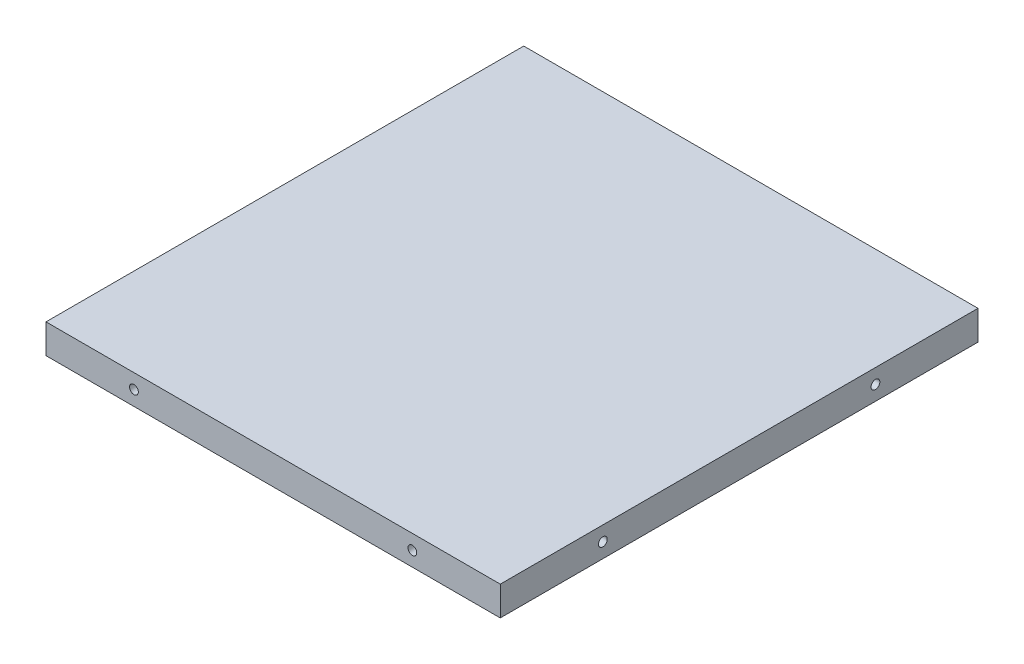
ISO-10303-21;
HEADER;
FILE_DESCRIPTION(('STEP AP214'),'2;1');
FILE_NAME('part.step','',(''),(''),'','','');
FILE_SCHEMA(('AUTOMOTIVE_DESIGN { 1 0 10303 214 1 1 1 1 }'));
ENDSEC;
DATA;
#1=APPLICATION_CONTEXT('core data for automotive mechanical design processes');
#2=APPLICATION_PROTOCOL_DEFINITION('international standard','automotive_design',2000,#1);
#3=PRODUCT_CONTEXT('',#1,'mechanical');
#4=PRODUCT('Part','Part','',(#3));
#5=PRODUCT_RELATED_PRODUCT_CATEGORY('part','',(#4));
#6=PRODUCT_DEFINITION_FORMATION('','',#4);
#7=PRODUCT_DEFINITION_CONTEXT('part definition',#1,'design');
#8=PRODUCT_DEFINITION('design','',#6,#7);
#9=PRODUCT_DEFINITION_SHAPE('','',#8);
#10=(LENGTH_UNIT() NAMED_UNIT(*) SI_UNIT(.MILLI.,.METRE.));
#11=(NAMED_UNIT(*) PLANE_ANGLE_UNIT() SI_UNIT($,.RADIAN.));
#12=(NAMED_UNIT(*) SI_UNIT($,.STERADIAN.) SOLID_ANGLE_UNIT());
#13=UNCERTAINTY_MEASURE_WITH_UNIT(LENGTH_MEASURE(1.E-05),#10,'distance_accuracy_value','');
#14=(GEOMETRIC_REPRESENTATION_CONTEXT(3) GLOBAL_UNCERTAINTY_ASSIGNED_CONTEXT((#13)) GLOBAL_UNIT_ASSIGNED_CONTEXT((#10,
#11,#12)) REPRESENTATION_CONTEXT('',''));
#15=CARTESIAN_POINT('',(0.,0.,0.));
#16=DIRECTION('',(0.,0.,1.));
#17=DIRECTION('',(1.,0.,0.));
#18=AXIS2_PLACEMENT_3D('',#15,#16,#17);
#19=CARTESIAN_POINT('',(0.,10.,0.));
#20=DIRECTION('',(-1.,0.,0.));
#21=DIRECTION('',(0.,0.,1.));
#22=AXIS2_PLACEMENT_3D('',#19,#20,#21);
#23=PLANE('',#22);
#24=CARTESIAN_POINT('',(0.,4.99999999999996,-35.));
#25=DIRECTION('',(1.,0.,0.));
#26=DIRECTION('',(0.,0.,-1.));
#27=AXIS2_PLACEMENT_3D('',#24,#25,#26);
#28=CIRCLE('',#27,1.5);
#29=CARTESIAN_POINT('',(0.,4.99999999999996,-36.5));
#30=VERTEX_POINT('',#29);
#31=EDGE_CURVE('E136',#30,#30,#28,.T.);
#32=ORIENTED_EDGE('',*,*,#31,.T.);
#33=EDGE_LOOP('',(#32));
#34=FACE_BOUND('',#33,.T.);
#35=CARTESIAN_POINT('',(0.,4.99999999999996,-128.));
#36=DIRECTION('',(1.,0.,0.));
#37=DIRECTION('',(0.,0.,1.));
#38=AXIS2_PLACEMENT_3D('',#35,#36,#37);
#39=CIRCLE('',#38,1.5);
#40=CARTESIAN_POINT('',(0.,4.99999999999996,-126.5));
#41=VERTEX_POINT('',#40);
#42=EDGE_CURVE('E144',#41,#41,#39,.T.);
#43=ORIENTED_EDGE('',*,*,#42,.T.);
#44=EDGE_LOOP('',(#43));
#45=FACE_BOUND('',#44,.T.);
#46=DIRECTION('',(0.,0.,-1.));
#47=VECTOR('',#46,1.);
#48=CARTESIAN_POINT('',(0.,0.,0.));
#49=LINE('',#48,#47);
#50=CARTESIAN_POINT('',(0.,0.,0.));
#51=VERTEX_POINT('',#50);
#52=CARTESIAN_POINT('',(0.,0.,-163.));
#53=VERTEX_POINT('',#52);
#54=EDGE_CURVE('E118',#51,#53,#49,.T.);
#55=ORIENTED_EDGE('',*,*,#54,.F.);
#56=DIRECTION('',(0.,-1.,0.));
#57=VECTOR('',#56,1.);
#58=CARTESIAN_POINT('',(0.,10.,0.));
#59=LINE('',#58,#57);
#60=CARTESIAN_POINT('',(0.,10.,0.));
#61=VERTEX_POINT('',#60);
#62=EDGE_CURVE('E11',#61,#51,#59,.T.);
#63=ORIENTED_EDGE('',*,*,#62,.F.);
#64=DIRECTION('',(0.,0.,-1.));
#65=VECTOR('',#64,1.);
#66=CARTESIAN_POINT('',(0.,10.,0.));
#67=LINE('',#66,#65);
#68=CARTESIAN_POINT('',(0.,10.,-163.));
#69=VERTEX_POINT('',#68);
#70=EDGE_CURVE('E110',#61,#69,#67,.T.);
#71=ORIENTED_EDGE('',*,*,#70,.T.);
#72=DIRECTION('',(0.,-1.,0.));
#73=VECTOR('',#72,1.);
#74=CARTESIAN_POINT('',(0.,10.,-163.));
#75=LINE('',#74,#73);
#76=EDGE_CURVE('E86',#69,#53,#75,.T.);
#77=ORIENTED_EDGE('',*,*,#76,.T.);
#78=EDGE_LOOP('',(#55,#63,#71,#77));
#79=FACE_BOUND('',#78,.T.);
#80=ADVANCED_FACE('F44',(#34,#45,#79),#23,.T.);
#81=CARTESIAN_POINT('',(0.,10.,0.));
#82=DIRECTION('',(0.,0.,-1.));
#83=DIRECTION('',(-1.,0.,0.));
#84=AXIS2_PLACEMENT_3D('',#81,#82,#83);
#85=PLANE('',#84);
#86=CARTESIAN_POINT('',(125.,5.,0.));
#87=DIRECTION('',(0.,0.,-1.));
#88=DIRECTION('',(-1.,0.,0.));
#89=AXIS2_PLACEMENT_3D('',#86,#87,#88);
#90=CIRCLE('',#89,1.5);
#91=CARTESIAN_POINT('',(123.5,5.,0.));
#92=VERTEX_POINT('',#91);
#93=EDGE_CURVE('E157',#92,#92,#90,.T.);
#94=ORIENTED_EDGE('',*,*,#93,.T.);
#95=EDGE_LOOP('',(#94));
#96=FACE_BOUND('',#95,.T.);
#97=CARTESIAN_POINT('',(30.,5.00000000000001,0.));
#98=DIRECTION('',(0.,0.,-1.));
#99=DIRECTION('',(1.,0.,0.));
#100=AXIS2_PLACEMENT_3D('',#97,#98,#99);
#101=CIRCLE('',#100,1.5);
#102=CARTESIAN_POINT('',(31.5,5.00000000000001,0.));
#103=VERTEX_POINT('',#102);
#104=EDGE_CURVE('E142',#103,#103,#101,.T.);
#105=ORIENTED_EDGE('',*,*,#104,.T.);
#106=EDGE_LOOP('',(#105));
#107=FACE_BOUND('',#106,.T.);
#108=DIRECTION('',(1.,0.,0.));
#109=VECTOR('',#108,1.);
#110=CARTESIAN_POINT('',(0.,0.,0.));
#111=LINE('',#110,#109);
#112=CARTESIAN_POINT('',(155.,0.,0.));
#113=VERTEX_POINT('',#112);
#114=EDGE_CURVE('E78',#51,#113,#111,.T.);
#115=ORIENTED_EDGE('',*,*,#114,.T.);
#116=DIRECTION('',(0.,-1.,0.));
#117=VECTOR('',#116,1.);
#118=CARTESIAN_POINT('',(155.,10.,0.));
#119=LINE('',#118,#117);
#120=CARTESIAN_POINT('',(155.,10.,0.));
#121=VERTEX_POINT('',#120);
#122=EDGE_CURVE('E54',#121,#113,#119,.T.);
#123=ORIENTED_EDGE('',*,*,#122,.F.);
#124=DIRECTION('',(1.,0.,0.));
#125=VECTOR('',#124,1.);
#126=CARTESIAN_POINT('',(0.,10.,0.));
#127=LINE('',#126,#125);
#128=EDGE_CURVE('E96',#61,#121,#127,.T.);
#129=ORIENTED_EDGE('',*,*,#128,.F.);
#130=ORIENTED_EDGE('',*,*,#62,.T.);
#131=EDGE_LOOP('',(#115,#123,#129,#130));
#132=FACE_BOUND('',#131,.T.);
#133=ADVANCED_FACE('F198',(#96,#107,#132),#85,.F.);
#134=CARTESIAN_POINT('',(155.,10.,0.));
#135=DIRECTION('',(-1.,0.,0.));
#136=DIRECTION('',(0.,0.,1.));
#137=AXIS2_PLACEMENT_3D('',#134,#135,#136);
#138=PLANE('',#137);
#139=CARTESIAN_POINT('',(155.,4.99999999999996,-35.));
#140=DIRECTION('',(-1.,0.,0.));
#141=DIRECTION('',(0.,0.,1.));
#142=AXIS2_PLACEMENT_3D('',#139,#140,#141);
#143=CIRCLE('',#142,1.5);
#144=CARTESIAN_POINT('',(155.,4.99999999999996,-33.5));
#145=VERTEX_POINT('',#144);
#146=EDGE_CURVE('E47',#145,#145,#143,.T.);
#147=ORIENTED_EDGE('',*,*,#146,.T.);
#148=EDGE_LOOP('',(#147));
#149=FACE_BOUND('',#148,.T.);
#150=CARTESIAN_POINT('',(155.,4.99999999999996,-128.));
#151=DIRECTION('',(-1.,0.,0.));
#152=DIRECTION('',(0.,0.,1.));
#153=AXIS2_PLACEMENT_3D('',#150,#151,#152);
#154=CIRCLE('',#153,1.5);
#155=CARTESIAN_POINT('',(155.,4.99999999999996,-126.5));
#156=VERTEX_POINT('',#155);
#157=EDGE_CURVE('E133',#156,#156,#154,.T.);
#158=ORIENTED_EDGE('',*,*,#157,.T.);
#159=EDGE_LOOP('',(#158));
#160=FACE_BOUND('',#159,.T.);
#161=DIRECTION('',(0.,0.,-1.));
#162=VECTOR('',#161,1.);
#163=CARTESIAN_POINT('',(155.,0.,0.));
#164=LINE('',#163,#162);
#165=CARTESIAN_POINT('',(155.,0.,-163.));
#166=VERTEX_POINT('',#165);
#167=EDGE_CURVE('E104',#113,#166,#164,.T.);
#168=ORIENTED_EDGE('',*,*,#167,.T.);
#169=DIRECTION('',(0.,-1.,0.));
#170=VECTOR('',#169,1.);
#171=CARTESIAN_POINT('',(155.,10.,-163.));
#172=LINE('',#171,#170);
#173=CARTESIAN_POINT('',(155.,10.,-163.));
#174=VERTEX_POINT('',#173);
#175=EDGE_CURVE('E101',#174,#166,#172,.T.);
#176=ORIENTED_EDGE('',*,*,#175,.F.);
#177=DIRECTION('',(0.,0.,-1.));
#178=VECTOR('',#177,1.);
#179=CARTESIAN_POINT('',(155.,10.,0.));
#180=LINE('',#179,#178);
#181=EDGE_CURVE('E91',#121,#174,#180,.T.);
#182=ORIENTED_EDGE('',*,*,#181,.F.);
#183=ORIENTED_EDGE('',*,*,#122,.T.);
#184=EDGE_LOOP('',(#168,#176,#182,#183));
#185=FACE_BOUND('',#184,.T.);
#186=ADVANCED_FACE('F102',(#149,#160,#185),#138,.F.);
#187=CARTESIAN_POINT('',(0.,10.,-163.));
#188=DIRECTION('',(0.,0.,-1.));
#189=DIRECTION('',(-1.,0.,0.));
#190=AXIS2_PLACEMENT_3D('',#187,#188,#189);
#191=PLANE('',#190);
#192=CARTESIAN_POINT('',(125.,5.,-163.));
#193=DIRECTION('',(0.,0.,-1.));
#194=DIRECTION('',(-1.,0.,0.));
#195=AXIS2_PLACEMENT_3D('',#192,#193,#194);
#196=CIRCLE('',#195,1.5);
#197=CARTESIAN_POINT('',(123.5,5.,-163.));
#198=VERTEX_POINT('',#197);
#199=EDGE_CURVE('E171',#198,#198,#196,.T.);
#200=ORIENTED_EDGE('',*,*,#199,.F.);
#201=EDGE_LOOP('',(#200));
#202=FACE_BOUND('',#201,.T.);
#203=CARTESIAN_POINT('',(30.,5.00000000000001,-163.));
#204=DIRECTION('',(0.,0.,-1.));
#205=DIRECTION('',(1.,0.,0.));
#206=AXIS2_PLACEMENT_3D('',#203,#204,#205);
#207=CIRCLE('',#206,1.5);
#208=CARTESIAN_POINT('',(31.5,5.00000000000001,-163.));
#209=VERTEX_POINT('',#208);
#210=EDGE_CURVE('E175',#209,#209,#207,.T.);
#211=ORIENTED_EDGE('',*,*,#210,.F.);
#212=EDGE_LOOP('',(#211));
#213=FACE_BOUND('',#212,.T.);
#214=DIRECTION('',(1.,0.,0.));
#215=VECTOR('',#214,1.);
#216=CARTESIAN_POINT('',(0.,0.,-163.));
#217=LINE('',#216,#215);
#218=EDGE_CURVE('E122',#53,#166,#217,.T.);
#219=ORIENTED_EDGE('',*,*,#218,.F.);
#220=ORIENTED_EDGE('',*,*,#76,.F.);
#221=DIRECTION('',(1.,0.,0.));
#222=VECTOR('',#221,1.);
#223=CARTESIAN_POINT('',(0.,10.,-163.));
#224=LINE('',#223,#222);
#225=EDGE_CURVE('E95',#69,#174,#224,.T.);
#226=ORIENTED_EDGE('',*,*,#225,.T.);
#227=ORIENTED_EDGE('',*,*,#175,.T.);
#228=EDGE_LOOP('',(#219,#220,#226,#227));
#229=FACE_BOUND('',#228,.T.);
#230=ADVANCED_FACE('F108',(#202,#213,#229),#191,.T.);
#231=CARTESIAN_POINT('',(0.,10.,0.));
#232=DIRECTION('',(0.,-1.,0.));
#233=DIRECTION('',(0.,0.,-1.));
#234=AXIS2_PLACEMENT_3D('',#231,#232,#233);
#235=PLANE('',#234);
#236=ORIENTED_EDGE('',*,*,#70,.F.);
#237=ORIENTED_EDGE('',*,*,#128,.T.);
#238=ORIENTED_EDGE('',*,*,#181,.T.);
#239=ORIENTED_EDGE('',*,*,#225,.F.);
#240=EDGE_LOOP('',(#236,#237,#238,#239));
#241=FACE_BOUND('',#240,.T.);
#242=ADVANCED_FACE('F94',(#241),#235,.F.);
#243=CARTESIAN_POINT('',(0.,0.,0.));
#244=DIRECTION('',(0.,-1.,0.));
#245=DIRECTION('',(0.,0.,-1.));
#246=AXIS2_PLACEMENT_3D('',#243,#244,#245);
#247=PLANE('',#246);
#248=ORIENTED_EDGE('',*,*,#54,.T.);
#249=ORIENTED_EDGE('',*,*,#218,.T.);
#250=ORIENTED_EDGE('',*,*,#167,.F.);
#251=ORIENTED_EDGE('',*,*,#114,.F.);
#252=EDGE_LOOP('',(#248,#249,#250,#251));
#253=FACE_BOUND('',#252,.T.);
#254=ADVANCED_FACE('F187',(#253),#247,.T.);
#255=CARTESIAN_POINT('',(30.,5.00000000000001,-143.));
#256=DIRECTION('',(0.,0.,-1.));
#257=DIRECTION('',(-1.,0.,0.));
#258=AXIS2_PLACEMENT_3D('',#255,#256,#257);
#259=CYLINDRICAL_SURFACE('',#258,1.5);
#260=CARTESIAN_POINT('',(30.,5.00000000000001,-143.));
#261=DIRECTION('',(0.,0.,-1.));
#262=DIRECTION('',(1.,0.,0.));
#263=AXIS2_PLACEMENT_3D('',#260,#261,#262);
#264=CIRCLE('',#263,1.5);
#265=CARTESIAN_POINT('',(31.5,5.00000000000001,-143.));
#266=VERTEX_POINT('',#265);
#267=EDGE_CURVE('E156',#266,#266,#264,.T.);
#268=ORIENTED_EDGE('',*,*,#267,.F.);
#269=EDGE_LOOP('',(#268));
#270=FACE_BOUND('',#269,.T.);
#271=ORIENTED_EDGE('',*,*,#210,.T.);
#272=EDGE_LOOP('',(#271));
#273=FACE_BOUND('',#272,.T.);
#274=ADVANCED_FACE('F184',(#270,#273),#259,.F.);
#275=CARTESIAN_POINT('',(30.,5.00000000000001,-143.));
#276=DIRECTION('',(0.,0.,1.));
#277=DIRECTION('',(1.,0.,0.));
#278=AXIS2_PLACEMENT_3D('',#275,#276,#277);
#279=PLANE('',#278);
#280=ORIENTED_EDGE('',*,*,#267,.T.);
#281=EDGE_LOOP('',(#280));
#282=FACE_BOUND('',#281,.T.);
#283=ADVANCED_FACE('F182',(#282),#279,.F.);
#284=CARTESIAN_POINT('',(125.,5.,-143.));
#285=DIRECTION('',(0.,0.,-1.));
#286=DIRECTION('',(-1.,0.,0.));
#287=AXIS2_PLACEMENT_3D('',#284,#285,#286);
#288=CYLINDRICAL_SURFACE('',#287,1.5);
#289=CARTESIAN_POINT('',(125.,5.,-143.));
#290=DIRECTION('',(0.,0.,-1.));
#291=DIRECTION('',(-1.,0.,0.));
#292=AXIS2_PLACEMENT_3D('',#289,#290,#291);
#293=CIRCLE('',#292,1.5);
#294=CARTESIAN_POINT('',(123.5,5.,-143.));
#295=VERTEX_POINT('',#294);
#296=EDGE_CURVE('E123',#295,#295,#293,.T.);
#297=ORIENTED_EDGE('',*,*,#296,.F.);
#298=EDGE_LOOP('',(#297));
#299=FACE_BOUND('',#298,.T.);
#300=ORIENTED_EDGE('',*,*,#199,.T.);
#301=EDGE_LOOP('',(#300));
#302=FACE_BOUND('',#301,.T.);
#303=ADVANCED_FACE('F217',(#299,#302),#288,.F.);
#304=CARTESIAN_POINT('',(125.,5.,-143.));
#305=DIRECTION('',(0.,0.,-1.));
#306=DIRECTION('',(-1.,0.,0.));
#307=AXIS2_PLACEMENT_3D('',#304,#305,#306);
#308=PLANE('',#307);
#309=ORIENTED_EDGE('',*,*,#296,.T.);
#310=EDGE_LOOP('',(#309));
#311=FACE_BOUND('',#310,.T.);
#312=ADVANCED_FACE('F221',(#311),#308,.T.);
#313=CARTESIAN_POINT('',(30.,5.00000000000001,-20.));
#314=DIRECTION('',(0.,0.,1.));
#315=DIRECTION('',(1.,0.,0.));
#316=AXIS2_PLACEMENT_3D('',#313,#314,#315);
#317=CYLINDRICAL_SURFACE('',#316,1.5);
#318=CARTESIAN_POINT('',(30.,5.00000000000001,-20.));
#319=DIRECTION('',(0.,0.,-1.));
#320=DIRECTION('',(1.,0.,0.));
#321=AXIS2_PLACEMENT_3D('',#318,#319,#320);
#322=CIRCLE('',#321,1.5);
#323=CARTESIAN_POINT('',(31.5,5.00000000000001,-20.));
#324=VERTEX_POINT('',#323);
#325=EDGE_CURVE('E161',#324,#324,#322,.T.);
#326=ORIENTED_EDGE('',*,*,#325,.T.);
#327=EDGE_LOOP('',(#326));
#328=FACE_BOUND('',#327,.T.);
#329=ORIENTED_EDGE('',*,*,#104,.F.);
#330=EDGE_LOOP('',(#329));
#331=FACE_BOUND('',#330,.T.);
#332=ADVANCED_FACE('F225',(#328,#331),#317,.F.);
#333=CARTESIAN_POINT('',(30.,5.00000000000001,-20.));
#334=DIRECTION('',(0.,0.,-1.));
#335=DIRECTION('',(1.,0.,0.));
#336=AXIS2_PLACEMENT_3D('',#333,#334,#335);
#337=PLANE('',#336);
#338=ORIENTED_EDGE('',*,*,#325,.F.);
#339=EDGE_LOOP('',(#338));
#340=FACE_BOUND('',#339,.T.);
#341=ADVANCED_FACE('F229',(#340),#337,.F.);
#342=CARTESIAN_POINT('',(125.,5.,-20.));
#343=DIRECTION('',(0.,0.,1.));
#344=DIRECTION('',(1.,0.,0.));
#345=AXIS2_PLACEMENT_3D('',#342,#343,#344);
#346=CYLINDRICAL_SURFACE('',#345,1.5);
#347=CARTESIAN_POINT('',(125.,5.,-20.));
#348=DIRECTION('',(0.,0.,-1.));
#349=DIRECTION('',(-1.,0.,0.));
#350=AXIS2_PLACEMENT_3D('',#347,#348,#349);
#351=CIRCLE('',#350,1.5);
#352=CARTESIAN_POINT('',(123.5,5.,-20.));
#353=VERTEX_POINT('',#352);
#354=EDGE_CURVE('E152',#353,#353,#351,.T.);
#355=ORIENTED_EDGE('',*,*,#354,.T.);
#356=EDGE_LOOP('',(#355));
#357=FACE_BOUND('',#356,.T.);
#358=ORIENTED_EDGE('',*,*,#93,.F.);
#359=EDGE_LOOP('',(#358));
#360=FACE_BOUND('',#359,.T.);
#361=ADVANCED_FACE('F233',(#357,#360),#346,.F.);
#362=CARTESIAN_POINT('',(125.,5.,-20.));
#363=DIRECTION('',(0.,0.,1.));
#364=DIRECTION('',(-1.,0.,0.));
#365=AXIS2_PLACEMENT_3D('',#362,#363,#364);
#366=PLANE('',#365);
#367=ORIENTED_EDGE('',*,*,#354,.F.);
#368=EDGE_LOOP('',(#367));
#369=FACE_BOUND('',#368,.T.);
#370=ADVANCED_FACE('F237',(#369),#366,.T.);
#371=CARTESIAN_POINT('',(0.,4.99999999999996,-128.));
#372=DIRECTION('',(1.,0.,0.));
#373=DIRECTION('',(0.,0.,-1.));
#374=AXIS2_PLACEMENT_3D('',#371,#372,#373);
#375=CYLINDRICAL_SURFACE('',#374,1.5);
#376=ORIENTED_EDGE('',*,*,#42,.F.);
#377=EDGE_LOOP('',(#376));
#378=FACE_BOUND('',#377,.T.);
#379=ORIENTED_EDGE('',*,*,#157,.F.);
#380=EDGE_LOOP('',(#379));
#381=FACE_BOUND('',#380,.T.);
#382=ADVANCED_FACE('F241',(#378,#381),#375,.F.);
#383=CARTESIAN_POINT('',(0.,4.99999999999996,-35.));
#384=DIRECTION('',(1.,0.,0.));
#385=DIRECTION('',(0.,0.,-1.));
#386=AXIS2_PLACEMENT_3D('',#383,#384,#385);
#387=CYLINDRICAL_SURFACE('',#386,1.5);
#388=ORIENTED_EDGE('',*,*,#31,.F.);
#389=EDGE_LOOP('',(#388));
#390=FACE_BOUND('',#389,.T.);
#391=ORIENTED_EDGE('',*,*,#146,.F.);
#392=EDGE_LOOP('',(#391));
#393=FACE_BOUND('',#392,.T.);
#394=ADVANCED_FACE('F245',(#390,#393),#387,.F.);
#395=CLOSED_SHELL('',(#80,#133,#186,#230,#242,#254,#274,#283,#303,#312,#332,#341,#361,#370,#382,#394));
#396=MANIFOLD_SOLID_BREP('B2',#395);
#397=ADVANCED_BREP_SHAPE_REPRESENTATION('',(#18,#396),#14);
#398=SHAPE_DEFINITION_REPRESENTATION(#9,#397);
ENDSEC;
END-ISO-10303-21;
